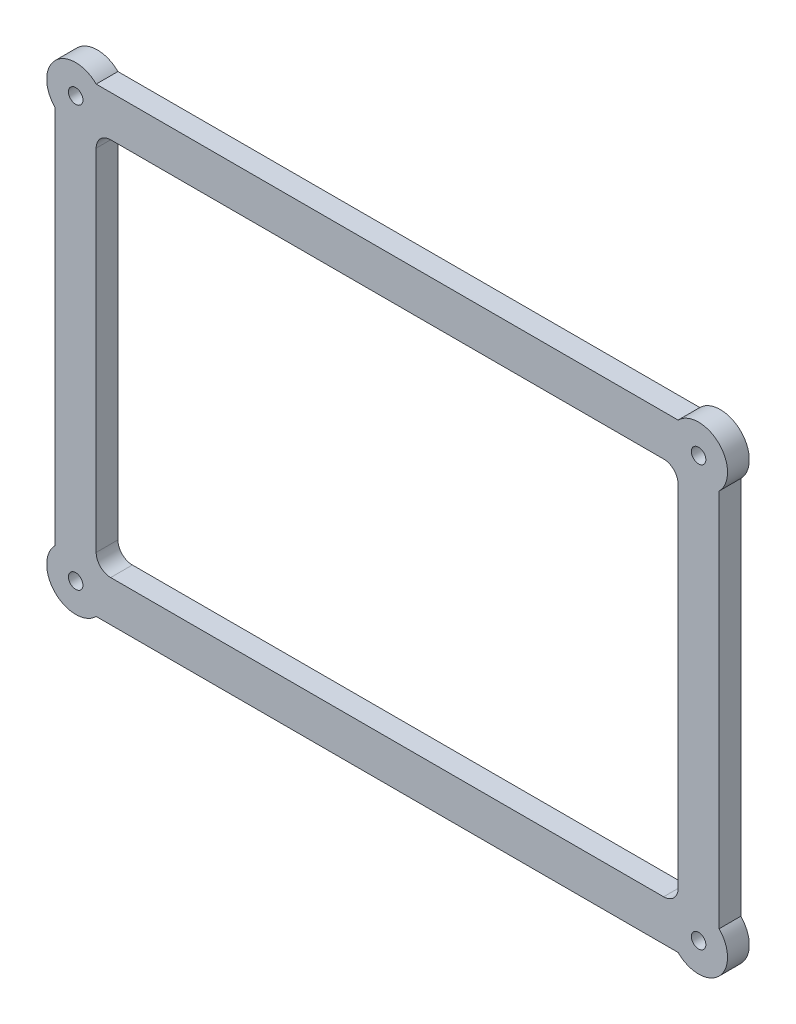
ISO-10303-21;
HEADER;
FILE_DESCRIPTION(('STEP AP214'),'2;1');
FILE_NAME('part.step','',(''),(''),'','','');
FILE_SCHEMA(('AUTOMOTIVE_DESIGN { 1 0 10303 214 1 1 1 1 }'));
ENDSEC;
DATA;
#1=APPLICATION_CONTEXT('core data for automotive mechanical design processes');
#2=APPLICATION_PROTOCOL_DEFINITION('international standard','automotive_design',2000,#1);
#3=PRODUCT_CONTEXT('',#1,'mechanical');
#4=PRODUCT('Part','Part','',(#3));
#5=PRODUCT_RELATED_PRODUCT_CATEGORY('part','',(#4));
#6=PRODUCT_DEFINITION_FORMATION('','',#4);
#7=PRODUCT_DEFINITION_CONTEXT('part definition',#1,'design');
#8=PRODUCT_DEFINITION('design','',#6,#7);
#9=PRODUCT_DEFINITION_SHAPE('','',#8);
#10=(LENGTH_UNIT() NAMED_UNIT(*) SI_UNIT(.MILLI.,.METRE.));
#11=(NAMED_UNIT(*) PLANE_ANGLE_UNIT() SI_UNIT($,.RADIAN.));
#12=(NAMED_UNIT(*) SI_UNIT($,.STERADIAN.) SOLID_ANGLE_UNIT());
#13=UNCERTAINTY_MEASURE_WITH_UNIT(LENGTH_MEASURE(1.E-05),#10,'distance_accuracy_value','');
#14=(GEOMETRIC_REPRESENTATION_CONTEXT(3) GLOBAL_UNCERTAINTY_ASSIGNED_CONTEXT((#13)) GLOBAL_UNIT_ASSIGNED_CONTEXT((#10,
#11,#12)) REPRESENTATION_CONTEXT('',''));
#15=CARTESIAN_POINT('',(0.,0.,0.));
#16=DIRECTION('',(0.,0.,1.));
#17=DIRECTION('',(1.,0.,0.));
#18=AXIS2_PLACEMENT_3D('',#15,#16,#17);
#19=CARTESIAN_POINT('',(0.,58.,3.));
#20=DIRECTION('',(0.,0.,1.));
#21=DIRECTION('',(1.,0.,0.));
#22=AXIS2_PLACEMENT_3D('',#19,#20,#21);
#23=PLANE('',#22);
#24=CARTESIAN_POINT('',(86.,58.,3.));
#25=DIRECTION('',(0.,0.,1.));
#26=DIRECTION('',(1.,0.,0.));
#27=AXIS2_PLACEMENT_3D('',#24,#25,#26);
#28=CIRCLE('',#27,0.999999999999998);
#29=CARTESIAN_POINT('',(87.,58.,3.));
#30=VERTEX_POINT('',#29);
#31=EDGE_CURVE('E288',#30,#30,#28,.T.);
#32=ORIENTED_EDGE('',*,*,#31,.F.);
#33=EDGE_LOOP('',(#32));
#34=FACE_BOUND('',#33,.T.);
#35=CARTESIAN_POINT('',(0.,58.,3.));
#36=DIRECTION('',(0.,0.,1.));
#37=DIRECTION('',(1.,0.,0.));
#38=AXIS2_PLACEMENT_3D('',#35,#36,#37);
#39=CIRCLE('',#38,1.);
#40=CARTESIAN_POINT('',(1.,58.,3.));
#41=VERTEX_POINT('',#40);
#42=EDGE_CURVE('E304',#41,#41,#39,.T.);
#43=ORIENTED_EDGE('',*,*,#42,.F.);
#44=EDGE_LOOP('',(#43));
#45=FACE_BOUND('',#44,.T.);
#46=CARTESIAN_POINT('',(0.,58.,3.));
#47=DIRECTION('',(0.,0.,1.));
#48=DIRECTION('',(1.,0.,0.));
#49=AXIS2_PLACEMENT_3D('',#46,#47,#48);
#50=CIRCLE('',#49,4.);
#51=CARTESIAN_POINT('',(2.82842712474619,60.8284271247462,3.));
#52=VERTEX_POINT('',#51);
#53=CARTESIAN_POINT('',(-2.82842712474619,55.1715728752538,3.));
#54=VERTEX_POINT('',#53);
#55=EDGE_CURVE('E169',#52,#54,#50,.T.);
#56=ORIENTED_EDGE('',*,*,#55,.T.);
#57=DIRECTION('',(0.,-1.,0.));
#58=VECTOR('',#57,1.);
#59=CARTESIAN_POINT('',(-2.82842712474619,55.1715728752538,3.));
#60=LINE('',#59,#58);
#61=CARTESIAN_POINT('',(-2.82842712474619,2.82842712474619,3.));
#62=VERTEX_POINT('',#61);
#63=EDGE_CURVE('E157',#54,#62,#60,.T.);
#64=ORIENTED_EDGE('',*,*,#63,.T.);
#65=CARTESIAN_POINT('',(0.,0.,3.));
#66=DIRECTION('',(0.,0.,1.));
#67=DIRECTION('',(1.,0.,0.));
#68=AXIS2_PLACEMENT_3D('',#65,#66,#67);
#69=CIRCLE('',#68,4.);
#70=CARTESIAN_POINT('',(2.82842712474619,-2.82842712474619,3.));
#71=VERTEX_POINT('',#70);
#72=EDGE_CURVE('E168',#62,#71,#69,.T.);
#73=ORIENTED_EDGE('',*,*,#72,.T.);
#74=DIRECTION('',(1.,0.,0.));
#75=VECTOR('',#74,1.);
#76=CARTESIAN_POINT('',(2.82842712474619,-2.82842712474619,3.));
#77=LINE('',#76,#75);
#78=CARTESIAN_POINT('',(83.1715728752538,-2.82842712474617,3.));
#79=VERTEX_POINT('',#78);
#80=EDGE_CURVE('E313',#71,#79,#77,.T.);
#81=ORIENTED_EDGE('',*,*,#80,.T.);
#82=CARTESIAN_POINT('',(86.,0.,3.));
#83=DIRECTION('',(0.,0.,1.));
#84=DIRECTION('',(1.,0.,0.));
#85=AXIS2_PLACEMENT_3D('',#82,#83,#84);
#86=CIRCLE('',#85,3.99999999999999);
#87=CARTESIAN_POINT('',(88.8284271247462,2.82842712474619,3.));
#88=VERTEX_POINT('',#87);
#89=EDGE_CURVE('E316',#79,#88,#86,.T.);
#90=ORIENTED_EDGE('',*,*,#89,.T.);
#91=DIRECTION('',(0.,1.,0.));
#92=VECTOR('',#91,1.);
#93=CARTESIAN_POINT('',(88.8284271247462,2.82842712474619,3.));
#94=LINE('',#93,#92);
#95=CARTESIAN_POINT('',(88.8284271247462,55.1715728752538,3.));
#96=VERTEX_POINT('',#95);
#97=EDGE_CURVE('E319',#88,#96,#94,.T.);
#98=ORIENTED_EDGE('',*,*,#97,.T.);
#99=CARTESIAN_POINT('',(86.,58.,3.));
#100=DIRECTION('',(0.,0.,1.));
#101=DIRECTION('',(1.,0.,0.));
#102=AXIS2_PLACEMENT_3D('',#99,#100,#101);
#103=CIRCLE('',#102,4.);
#104=CARTESIAN_POINT('',(83.1715728752538,60.8284271247462,3.));
#105=VERTEX_POINT('',#104);
#106=EDGE_CURVE('E322',#96,#105,#103,.T.);
#107=ORIENTED_EDGE('',*,*,#106,.T.);
#108=DIRECTION('',(-1.,0.,0.));
#109=VECTOR('',#108,1.);
#110=CARTESIAN_POINT('',(2.82842712474619,60.8284271247462,3.));
#111=LINE('',#110,#109);
#112=EDGE_CURVE('E174',#105,#52,#111,.T.);
#113=ORIENTED_EDGE('',*,*,#112,.T.);
#114=EDGE_LOOP('',(#56,#64,#73,#81,#90,#98,#107,#113));
#115=FACE_BOUND('',#114,.T.);
#116=CARTESIAN_POINT('',(0.,0.,3.));
#117=DIRECTION('',(0.,0.,1.));
#118=DIRECTION('',(1.,0.,0.));
#119=AXIS2_PLACEMENT_3D('',#116,#117,#118);
#120=CIRCLE('',#119,1.);
#121=CARTESIAN_POINT('',(1.,0.,3.));
#122=VERTEX_POINT('',#121);
#123=EDGE_CURVE('E296',#122,#122,#120,.T.);
#124=ORIENTED_EDGE('',*,*,#123,.F.);
#125=EDGE_LOOP('',(#124));
#126=FACE_BOUND('',#125,.T.);
#127=CARTESIAN_POINT('',(86.,0.,3.));
#128=DIRECTION('',(0.,0.,1.));
#129=DIRECTION('',(1.,0.,0.));
#130=AXIS2_PLACEMENT_3D('',#127,#128,#129);
#131=CIRCLE('',#130,0.999999999999998);
#132=CARTESIAN_POINT('',(87.,0.,3.));
#133=VERTEX_POINT('',#132);
#134=EDGE_CURVE('E280',#133,#133,#131,.T.);
#135=ORIENTED_EDGE('',*,*,#134,.F.);
#136=EDGE_LOOP('',(#135));
#137=FACE_BOUND('',#136,.T.);
#138=DIRECTION('',(-1.,0.,0.));
#139=VECTOR('',#138,1.);
#140=CARTESIAN_POINT('',(2.82842712474619,55.1715728752538,3.));
#141=LINE('',#140,#139);
#142=CARTESIAN_POINT('',(81.1715728752538,55.1715728752538,3.));
#143=VERTEX_POINT('',#142);
#144=CARTESIAN_POINT('',(4.82842712474619,55.1715728752538,3.));
#145=VERTEX_POINT('',#144);
#146=EDGE_CURVE('E255',#143,#145,#141,.T.);
#147=ORIENTED_EDGE('',*,*,#146,.F.);
#148=CARTESIAN_POINT('',(81.1715728752538,53.1715728752538,3.));
#149=DIRECTION('',(0.,0.,1.));
#150=DIRECTION('',(1.,0.,0.));
#151=AXIS2_PLACEMENT_3D('',#148,#149,#150);
#152=CIRCLE('',#151,2.);
#153=CARTESIAN_POINT('',(83.1715728752538,53.1715728752538,3.));
#154=VERTEX_POINT('',#153);
#155=EDGE_CURVE('E233',#143,#154,#152,.F.);
#156=ORIENTED_EDGE('',*,*,#155,.T.);
#157=DIRECTION('',(0.,1.,0.));
#158=VECTOR('',#157,1.);
#159=CARTESIAN_POINT('',(83.1715728752538,2.82842712474618,3.));
#160=LINE('',#159,#158);
#161=CARTESIAN_POINT('',(83.1715728752538,4.82842712474618,3.));
#162=VERTEX_POINT('',#161);
#163=EDGE_CURVE('E259',#162,#154,#160,.T.);
#164=ORIENTED_EDGE('',*,*,#163,.F.);
#165=CARTESIAN_POINT('',(81.1715728752538,4.82842712474618,3.));
#166=DIRECTION('',(0.,0.,1.));
#167=DIRECTION('',(1.,0.,0.));
#168=AXIS2_PLACEMENT_3D('',#165,#166,#167);
#169=CIRCLE('',#168,2.);
#170=CARTESIAN_POINT('',(81.1715728752538,2.82842712474618,3.));
#171=VERTEX_POINT('',#170);
#172=EDGE_CURVE('E227',#162,#171,#169,.F.);
#173=ORIENTED_EDGE('',*,*,#172,.T.);
#174=DIRECTION('',(1.,0.,0.));
#175=VECTOR('',#174,1.);
#176=CARTESIAN_POINT('',(2.82842712474619,2.82842712474619,3.));
#177=LINE('',#176,#175);
#178=CARTESIAN_POINT('',(4.82842712474619,2.82842712474619,3.));
#179=VERTEX_POINT('',#178);
#180=EDGE_CURVE('E263',#179,#171,#177,.T.);
#181=ORIENTED_EDGE('',*,*,#180,.F.);
#182=CARTESIAN_POINT('',(4.82842712474619,4.82842712474619,3.));
#183=DIRECTION('',(0.,0.,1.));
#184=DIRECTION('',(1.,0.,0.));
#185=AXIS2_PLACEMENT_3D('',#182,#183,#184);
#186=CIRCLE('',#185,2.);
#187=CARTESIAN_POINT('',(2.82842712474619,4.82842712474619,3.));
#188=VERTEX_POINT('',#187);
#189=EDGE_CURVE('E221',#179,#188,#186,.F.);
#190=ORIENTED_EDGE('',*,*,#189,.T.);
#191=DIRECTION('',(0.,-1.,0.));
#192=VECTOR('',#191,1.);
#193=CARTESIAN_POINT('',(2.82842712474619,55.1715728752538,3.));
#194=LINE('',#193,#192);
#195=CARTESIAN_POINT('',(2.82842712474619,53.1715728752538,3.));
#196=VERTEX_POINT('',#195);
#197=EDGE_CURVE('E258',#196,#188,#194,.T.);
#198=ORIENTED_EDGE('',*,*,#197,.F.);
#199=CARTESIAN_POINT('',(4.82842712474619,53.1715728752538,3.));
#200=DIRECTION('',(0.,0.,1.));
#201=DIRECTION('',(1.,0.,0.));
#202=AXIS2_PLACEMENT_3D('',#199,#200,#201);
#203=CIRCLE('',#202,2.);
#204=EDGE_CURVE('E11',#196,#145,#203,.F.);
#205=ORIENTED_EDGE('',*,*,#204,.T.);
#206=EDGE_LOOP('',(#147,#156,#164,#173,#181,#190,#198,#205));
#207=FACE_BOUND('',#206,.T.);
#208=ADVANCED_FACE('F43',(#34,#45,#115,#126,#137,#207),#23,.T.);
#209=CARTESIAN_POINT('',(0.,58.,0.));
#210=DIRECTION('',(0.,0.,1.));
#211=DIRECTION('',(1.,0.,0.));
#212=AXIS2_PLACEMENT_3D('',#209,#210,#211);
#213=PLANE('',#212);
#214=CARTESIAN_POINT('',(86.,0.,0.));
#215=DIRECTION('',(0.,0.,1.));
#216=DIRECTION('',(1.,0.,0.));
#217=AXIS2_PLACEMENT_3D('',#214,#215,#216);
#218=CIRCLE('',#217,0.999999999999998);
#219=CARTESIAN_POINT('',(87.,0.,0.));
#220=VERTEX_POINT('',#219);
#221=EDGE_CURVE('E271',#220,#220,#218,.T.);
#222=ORIENTED_EDGE('',*,*,#221,.T.);
#223=EDGE_LOOP('',(#222));
#224=FACE_BOUND('',#223,.T.);
#225=CARTESIAN_POINT('',(86.,58.,0.));
#226=DIRECTION('',(0.,0.,1.));
#227=DIRECTION('',(1.,0.,0.));
#228=AXIS2_PLACEMENT_3D('',#225,#226,#227);
#229=CIRCLE('',#228,0.999999999999998);
#230=CARTESIAN_POINT('',(87.,58.,0.));
#231=VERTEX_POINT('',#230);
#232=EDGE_CURVE('E284',#231,#231,#229,.T.);
#233=ORIENTED_EDGE('',*,*,#232,.T.);
#234=EDGE_LOOP('',(#233));
#235=FACE_BOUND('',#234,.T.);
#236=CARTESIAN_POINT('',(0.,0.,0.));
#237=DIRECTION('',(0.,0.,1.));
#238=DIRECTION('',(1.,0.,0.));
#239=AXIS2_PLACEMENT_3D('',#236,#237,#238);
#240=CIRCLE('',#239,1.);
#241=CARTESIAN_POINT('',(1.,0.,0.));
#242=VERTEX_POINT('',#241);
#243=EDGE_CURVE('E292',#242,#242,#240,.T.);
#244=ORIENTED_EDGE('',*,*,#243,.T.);
#245=EDGE_LOOP('',(#244));
#246=FACE_BOUND('',#245,.T.);
#247=CARTESIAN_POINT('',(0.,58.,0.));
#248=DIRECTION('',(0.,0.,1.));
#249=DIRECTION('',(1.,0.,0.));
#250=AXIS2_PLACEMENT_3D('',#247,#248,#249);
#251=CIRCLE('',#250,1.);
#252=CARTESIAN_POINT('',(1.,58.,0.));
#253=VERTEX_POINT('',#252);
#254=EDGE_CURVE('E300',#253,#253,#251,.T.);
#255=ORIENTED_EDGE('',*,*,#254,.T.);
#256=EDGE_LOOP('',(#255));
#257=FACE_BOUND('',#256,.T.);
#258=CARTESIAN_POINT('',(0.,58.,0.));
#259=DIRECTION('',(0.,0.,1.));
#260=DIRECTION('',(1.,0.,0.));
#261=AXIS2_PLACEMENT_3D('',#258,#259,#260);
#262=CIRCLE('',#261,4.);
#263=CARTESIAN_POINT('',(2.82842712474619,60.8284271247462,0.));
#264=VERTEX_POINT('',#263);
#265=CARTESIAN_POINT('',(-2.82842712474619,55.1715728752538,0.));
#266=VERTEX_POINT('',#265);
#267=EDGE_CURVE('E183',#264,#266,#262,.T.);
#268=ORIENTED_EDGE('',*,*,#267,.F.);
#269=DIRECTION('',(-1.,0.,0.));
#270=VECTOR('',#269,1.);
#271=CARTESIAN_POINT('',(2.82842712474619,60.8284271247462,0.));
#272=LINE('',#271,#270);
#273=CARTESIAN_POINT('',(83.1715728752538,60.8284271247462,0.));
#274=VERTEX_POINT('',#273);
#275=EDGE_CURVE('E179',#274,#264,#272,.T.);
#276=ORIENTED_EDGE('',*,*,#275,.F.);
#277=CARTESIAN_POINT('',(86.,58.,0.));
#278=DIRECTION('',(0.,0.,1.));
#279=DIRECTION('',(1.,0.,0.));
#280=AXIS2_PLACEMENT_3D('',#277,#278,#279);
#281=CIRCLE('',#280,4.);
#282=CARTESIAN_POINT('',(88.8284271247462,55.1715728752538,0.));
#283=VERTEX_POINT('',#282);
#284=EDGE_CURVE('E345',#283,#274,#281,.T.);
#285=ORIENTED_EDGE('',*,*,#284,.F.);
#286=DIRECTION('',(0.,1.,0.));
#287=VECTOR('',#286,1.);
#288=CARTESIAN_POINT('',(88.8284271247462,2.82842712474619,0.));
#289=LINE('',#288,#287);
#290=CARTESIAN_POINT('',(88.8284271247462,2.82842712474619,0.));
#291=VERTEX_POINT('',#290);
#292=EDGE_CURVE('E342',#291,#283,#289,.T.);
#293=ORIENTED_EDGE('',*,*,#292,.F.);
#294=CARTESIAN_POINT('',(86.,0.,0.));
#295=DIRECTION('',(0.,0.,1.));
#296=DIRECTION('',(1.,0.,0.));
#297=AXIS2_PLACEMENT_3D('',#294,#295,#296);
#298=CIRCLE('',#297,3.99999999999999);
#299=CARTESIAN_POINT('',(83.1715728752538,-2.82842712474617,0.));
#300=VERTEX_POINT('',#299);
#301=EDGE_CURVE('E339',#300,#291,#298,.T.);
#302=ORIENTED_EDGE('',*,*,#301,.F.);
#303=DIRECTION('',(1.,0.,0.));
#304=VECTOR('',#303,1.);
#305=CARTESIAN_POINT('',(2.82842712474619,-2.82842712474619,0.));
#306=LINE('',#305,#304);
#307=CARTESIAN_POINT('',(2.82842712474619,-2.82842712474619,0.));
#308=VERTEX_POINT('',#307);
#309=EDGE_CURVE('E336',#308,#300,#306,.T.);
#310=ORIENTED_EDGE('',*,*,#309,.F.);
#311=CARTESIAN_POINT('',(0.,0.,0.));
#312=DIRECTION('',(0.,0.,1.));
#313=DIRECTION('',(1.,0.,0.));
#314=AXIS2_PLACEMENT_3D('',#311,#312,#313);
#315=CIRCLE('',#314,4.);
#316=CARTESIAN_POINT('',(-2.82842712474619,2.82842712474619,0.));
#317=VERTEX_POINT('',#316);
#318=EDGE_CURVE('E333',#317,#308,#315,.T.);
#319=ORIENTED_EDGE('',*,*,#318,.F.);
#320=DIRECTION('',(0.,-1.,0.));
#321=VECTOR('',#320,1.);
#322=CARTESIAN_POINT('',(-2.82842712474619,55.1715728752538,0.));
#323=LINE('',#322,#321);
#324=EDGE_CURVE('E330',#266,#317,#323,.T.);
#325=ORIENTED_EDGE('',*,*,#324,.F.);
#326=EDGE_LOOP('',(#268,#276,#285,#293,#302,#310,#319,#325));
#327=FACE_BOUND('',#326,.T.);
#328=DIRECTION('',(1.,0.,0.));
#329=VECTOR('',#328,1.);
#330=CARTESIAN_POINT('',(2.82842712474619,2.82842712474619,0.));
#331=LINE('',#330,#329);
#332=CARTESIAN_POINT('',(4.82842712474619,2.82842712474619,0.));
#333=VERTEX_POINT('',#332);
#334=CARTESIAN_POINT('',(81.1715728752538,2.82842712474618,0.));
#335=VERTEX_POINT('',#334);
#336=EDGE_CURVE('E252',#333,#335,#331,.T.);
#337=ORIENTED_EDGE('',*,*,#336,.T.);
#338=CARTESIAN_POINT('',(81.1715728752538,4.82842712474618,0.));
#339=DIRECTION('',(0.,0.,1.));
#340=DIRECTION('',(1.,0.,0.));
#341=AXIS2_PLACEMENT_3D('',#338,#339,#340);
#342=CIRCLE('',#341,2.);
#343=CARTESIAN_POINT('',(83.1715728752538,4.82842712474618,0.));
#344=VERTEX_POINT('',#343);
#345=EDGE_CURVE('E224',#335,#344,#342,.T.);
#346=ORIENTED_EDGE('',*,*,#345,.T.);
#347=DIRECTION('',(0.,1.,0.));
#348=VECTOR('',#347,1.);
#349=CARTESIAN_POINT('',(83.1715728752538,2.82842712474618,0.));
#350=LINE('',#349,#348);
#351=CARTESIAN_POINT('',(83.1715728752538,53.1715728752538,0.));
#352=VERTEX_POINT('',#351);
#353=EDGE_CURVE('E272',#344,#352,#350,.T.);
#354=ORIENTED_EDGE('',*,*,#353,.T.);
#355=CARTESIAN_POINT('',(81.1715728752538,53.1715728752538,0.));
#356=DIRECTION('',(0.,0.,1.));
#357=DIRECTION('',(1.,0.,0.));
#358=AXIS2_PLACEMENT_3D('',#355,#356,#357);
#359=CIRCLE('',#358,2.);
#360=CARTESIAN_POINT('',(81.1715728752538,55.1715728752538,0.));
#361=VERTEX_POINT('',#360);
#362=EDGE_CURVE('E230',#352,#361,#359,.T.);
#363=ORIENTED_EDGE('',*,*,#362,.T.);
#364=DIRECTION('',(-1.,0.,0.));
#365=VECTOR('',#364,1.);
#366=CARTESIAN_POINT('',(2.82842712474619,55.1715728752538,0.));
#367=LINE('',#366,#365);
#368=CARTESIAN_POINT('',(4.82842712474619,55.1715728752538,0.));
#369=VERTEX_POINT('',#368);
#370=EDGE_CURVE('E243',#361,#369,#367,.T.);
#371=ORIENTED_EDGE('',*,*,#370,.T.);
#372=CARTESIAN_POINT('',(4.82842712474619,53.1715728752538,0.));
#373=DIRECTION('',(0.,0.,1.));
#374=DIRECTION('',(1.,0.,0.));
#375=AXIS2_PLACEMENT_3D('',#372,#373,#374);
#376=CIRCLE('',#375,2.);
#377=CARTESIAN_POINT('',(2.82842712474619,53.1715728752538,0.));
#378=VERTEX_POINT('',#377);
#379=EDGE_CURVE('E52',#369,#378,#376,.T.);
#380=ORIENTED_EDGE('',*,*,#379,.T.);
#381=DIRECTION('',(0.,-1.,0.));
#382=VECTOR('',#381,1.);
#383=CARTESIAN_POINT('',(2.82842712474619,55.1715728752538,0.));
#384=LINE('',#383,#382);
#385=CARTESIAN_POINT('',(2.82842712474619,4.82842712474619,0.));
#386=VERTEX_POINT('',#385);
#387=EDGE_CURVE('E242',#378,#386,#384,.T.);
#388=ORIENTED_EDGE('',*,*,#387,.T.);
#389=CARTESIAN_POINT('',(4.82842712474619,4.82842712474619,0.));
#390=DIRECTION('',(0.,0.,1.));
#391=DIRECTION('',(1.,0.,0.));
#392=AXIS2_PLACEMENT_3D('',#389,#390,#391);
#393=CIRCLE('',#392,2.);
#394=EDGE_CURVE('E218',#386,#333,#393,.T.);
#395=ORIENTED_EDGE('',*,*,#394,.T.);
#396=EDGE_LOOP('',(#337,#346,#354,#363,#371,#380,#388,#395));
#397=FACE_BOUND('',#396,.T.);
#398=ADVANCED_FACE('F241',(#224,#235,#246,#257,#327,#397),#213,.F.);
#399=CARTESIAN_POINT('',(0.,58.,3.));
#400=DIRECTION('',(0.,0.,-1.));
#401=DIRECTION('',(-1.,0.,0.));
#402=AXIS2_PLACEMENT_3D('',#399,#400,#401);
#403=CYLINDRICAL_SURFACE('',#402,4.);
#404=ORIENTED_EDGE('',*,*,#267,.T.);
#405=DIRECTION('',(0.,0.,-1.));
#406=VECTOR('',#405,1.);
#407=CARTESIAN_POINT('',(-2.82842712474619,55.1715728752538,3.));
#408=LINE('',#407,#406);
#409=EDGE_CURVE('E161',#54,#266,#408,.T.);
#410=ORIENTED_EDGE('',*,*,#409,.F.);
#411=ORIENTED_EDGE('',*,*,#55,.F.);
#412=DIRECTION('',(0.,0.,-1.));
#413=VECTOR('',#412,1.);
#414=CARTESIAN_POINT('',(2.82842712474619,60.8284271247462,3.));
#415=LINE('',#414,#413);
#416=EDGE_CURVE('E327',#52,#264,#415,.T.);
#417=ORIENTED_EDGE('',*,*,#416,.T.);
#418=EDGE_LOOP('',(#404,#410,#411,#417));
#419=FACE_BOUND('',#418,.T.);
#420=ADVANCED_FACE('F181',(#419),#403,.T.);
#421=CARTESIAN_POINT('',(-2.82842712474619,55.1715728752538,3.));
#422=DIRECTION('',(1.,0.,0.));
#423=DIRECTION('',(0.,0.,-1.));
#424=AXIS2_PLACEMENT_3D('',#421,#422,#423);
#425=PLANE('',#424);
#426=ORIENTED_EDGE('',*,*,#324,.T.);
#427=DIRECTION('',(0.,0.,-1.));
#428=VECTOR('',#427,1.);
#429=CARTESIAN_POINT('',(-2.82842712474619,2.82842712474619,3.));
#430=LINE('',#429,#428);
#431=EDGE_CURVE('E164',#62,#317,#430,.T.);
#432=ORIENTED_EDGE('',*,*,#431,.F.);
#433=ORIENTED_EDGE('',*,*,#63,.F.);
#434=ORIENTED_EDGE('',*,*,#409,.T.);
#435=EDGE_LOOP('',(#426,#432,#433,#434));
#436=FACE_BOUND('',#435,.T.);
#437=ADVANCED_FACE('F159',(#436),#425,.F.);
#438=CARTESIAN_POINT('',(0.,0.,3.));
#439=DIRECTION('',(0.,0.,-1.));
#440=DIRECTION('',(-1.,0.,0.));
#441=AXIS2_PLACEMENT_3D('',#438,#439,#440);
#442=CYLINDRICAL_SURFACE('',#441,4.);
#443=ORIENTED_EDGE('',*,*,#318,.T.);
#444=DIRECTION('',(0.,0.,-1.));
#445=VECTOR('',#444,1.);
#446=CARTESIAN_POINT('',(2.82842712474619,-2.82842712474619,3.));
#447=LINE('',#446,#445);
#448=EDGE_CURVE('E191',#71,#308,#447,.T.);
#449=ORIENTED_EDGE('',*,*,#448,.F.);
#450=ORIENTED_EDGE('',*,*,#72,.F.);
#451=ORIENTED_EDGE('',*,*,#431,.T.);
#452=EDGE_LOOP('',(#443,#449,#450,#451));
#453=FACE_BOUND('',#452,.T.);
#454=ADVANCED_FACE('F391',(#453),#442,.T.);
#455=CARTESIAN_POINT('',(2.82842712474619,-2.82842712474619,3.));
#456=DIRECTION('',(0.,1.,0.));
#457=DIRECTION('',(-1.,0.,0.));
#458=AXIS2_PLACEMENT_3D('',#455,#456,#457);
#459=PLANE('',#458);
#460=ORIENTED_EDGE('',*,*,#309,.T.);
#461=DIRECTION('',(0.,0.,-1.));
#462=VECTOR('',#461,1.);
#463=CARTESIAN_POINT('',(83.1715728752538,-2.82842712474617,3.));
#464=LINE('',#463,#462);
#465=EDGE_CURVE('E364',#79,#300,#464,.T.);
#466=ORIENTED_EDGE('',*,*,#465,.F.);
#467=ORIENTED_EDGE('',*,*,#80,.F.);
#468=ORIENTED_EDGE('',*,*,#448,.T.);
#469=EDGE_LOOP('',(#460,#466,#467,#468));
#470=FACE_BOUND('',#469,.T.);
#471=ADVANCED_FACE('F373',(#470),#459,.F.);
#472=CARTESIAN_POINT('',(86.,0.,3.));
#473=DIRECTION('',(0.,0.,-1.));
#474=DIRECTION('',(-1.,0.,0.));
#475=AXIS2_PLACEMENT_3D('',#472,#473,#474);
#476=CYLINDRICAL_SURFACE('',#475,3.99999999999999);
#477=ORIENTED_EDGE('',*,*,#301,.T.);
#478=DIRECTION('',(0.,0.,-1.));
#479=VECTOR('',#478,1.);
#480=CARTESIAN_POINT('',(88.8284271247462,2.82842712474619,3.));
#481=LINE('',#480,#479);
#482=EDGE_CURVE('E360',#88,#291,#481,.T.);
#483=ORIENTED_EDGE('',*,*,#482,.F.);
#484=ORIENTED_EDGE('',*,*,#89,.F.);
#485=ORIENTED_EDGE('',*,*,#465,.T.);
#486=EDGE_LOOP('',(#477,#483,#484,#485));
#487=FACE_BOUND('',#486,.T.);
#488=ADVANCED_FACE('F383',(#487),#476,.T.);
#489=CARTESIAN_POINT('',(88.8284271247462,2.82842712474619,3.));
#490=DIRECTION('',(-1.,0.,0.));
#491=DIRECTION('',(0.,0.,1.));
#492=AXIS2_PLACEMENT_3D('',#489,#490,#491);
#493=PLANE('',#492);
#494=ORIENTED_EDGE('',*,*,#292,.T.);
#495=DIRECTION('',(0.,0.,-1.));
#496=VECTOR('',#495,1.);
#497=CARTESIAN_POINT('',(88.8284271247462,55.1715728752538,3.));
#498=LINE('',#497,#496);
#499=EDGE_CURVE('E356',#96,#283,#498,.T.);
#500=ORIENTED_EDGE('',*,*,#499,.F.);
#501=ORIENTED_EDGE('',*,*,#97,.F.);
#502=ORIENTED_EDGE('',*,*,#482,.T.);
#503=EDGE_LOOP('',(#494,#500,#501,#502));
#504=FACE_BOUND('',#503,.T.);
#505=ADVANCED_FACE('F387',(#504),#493,.F.);
#506=CARTESIAN_POINT('',(86.,58.,3.));
#507=DIRECTION('',(0.,0.,-1.));
#508=DIRECTION('',(-1.,0.,0.));
#509=AXIS2_PLACEMENT_3D('',#506,#507,#508);
#510=CYLINDRICAL_SURFACE('',#509,4.);
#511=ORIENTED_EDGE('',*,*,#284,.T.);
#512=DIRECTION('',(0.,0.,-1.));
#513=VECTOR('',#512,1.);
#514=CARTESIAN_POINT('',(83.1715728752538,60.8284271247462,3.));
#515=LINE('',#514,#513);
#516=EDGE_CURVE('E352',#105,#274,#515,.T.);
#517=ORIENTED_EDGE('',*,*,#516,.F.);
#518=ORIENTED_EDGE('',*,*,#106,.F.);
#519=ORIENTED_EDGE('',*,*,#499,.T.);
#520=EDGE_LOOP('',(#511,#517,#518,#519));
#521=FACE_BOUND('',#520,.T.);
#522=ADVANCED_FACE('F417',(#521),#510,.T.);
#523=CARTESIAN_POINT('',(2.82842712474619,60.8284271247462,3.));
#524=DIRECTION('',(0.,-1.,0.));
#525=DIRECTION('',(1.,0.,0.));
#526=AXIS2_PLACEMENT_3D('',#523,#524,#525);
#527=PLANE('',#526);
#528=ORIENTED_EDGE('',*,*,#275,.T.);
#529=ORIENTED_EDGE('',*,*,#416,.F.);
#530=ORIENTED_EDGE('',*,*,#112,.F.);
#531=ORIENTED_EDGE('',*,*,#516,.T.);
#532=EDGE_LOOP('',(#528,#529,#530,#531));
#533=FACE_BOUND('',#532,.T.);
#534=ADVANCED_FACE('F414',(#533),#527,.F.);
#535=CARTESIAN_POINT('',(0.,58.,3.));
#536=DIRECTION('',(0.,0.,-1.));
#537=DIRECTION('',(-1.,0.,0.));
#538=AXIS2_PLACEMENT_3D('',#535,#536,#537);
#539=CYLINDRICAL_SURFACE('',#538,1.);
#540=ORIENTED_EDGE('',*,*,#42,.T.);
#541=EDGE_LOOP('',(#540));
#542=FACE_BOUND('',#541,.T.);
#543=ORIENTED_EDGE('',*,*,#254,.F.);
#544=EDGE_LOOP('',(#543));
#545=FACE_BOUND('',#544,.T.);
#546=ADVANCED_FACE('F411',(#542,#545),#539,.F.);
#547=CARTESIAN_POINT('',(0.,0.,3.));
#548=DIRECTION('',(0.,0.,-1.));
#549=DIRECTION('',(-1.,0.,0.));
#550=AXIS2_PLACEMENT_3D('',#547,#548,#549);
#551=CYLINDRICAL_SURFACE('',#550,1.);
#552=ORIENTED_EDGE('',*,*,#123,.T.);
#553=EDGE_LOOP('',(#552));
#554=FACE_BOUND('',#553,.T.);
#555=ORIENTED_EDGE('',*,*,#243,.F.);
#556=EDGE_LOOP('',(#555));
#557=FACE_BOUND('',#556,.T.);
#558=ADVANCED_FACE('F447',(#554,#557),#551,.F.);
#559=CARTESIAN_POINT('',(86.,58.,3.));
#560=DIRECTION('',(0.,0.,-1.));
#561=DIRECTION('',(-1.,0.,0.));
#562=AXIS2_PLACEMENT_3D('',#559,#560,#561);
#563=CYLINDRICAL_SURFACE('',#562,0.999999999999998);
#564=ORIENTED_EDGE('',*,*,#31,.T.);
#565=EDGE_LOOP('',(#564));
#566=FACE_BOUND('',#565,.T.);
#567=ORIENTED_EDGE('',*,*,#232,.F.);
#568=EDGE_LOOP('',(#567));
#569=FACE_BOUND('',#568,.T.);
#570=ADVANCED_FACE('F454',(#566,#569),#563,.F.);
#571=CARTESIAN_POINT('',(86.,0.,3.));
#572=DIRECTION('',(0.,0.,-1.));
#573=DIRECTION('',(-1.,0.,0.));
#574=AXIS2_PLACEMENT_3D('',#571,#572,#573);
#575=CYLINDRICAL_SURFACE('',#574,0.999999999999998);
#576=ORIENTED_EDGE('',*,*,#134,.T.);
#577=EDGE_LOOP('',(#576));
#578=FACE_BOUND('',#577,.T.);
#579=ORIENTED_EDGE('',*,*,#221,.F.);
#580=EDGE_LOOP('',(#579));
#581=FACE_BOUND('',#580,.T.);
#582=ADVANCED_FACE('F461',(#578,#581),#575,.F.);
#583=CARTESIAN_POINT('',(83.1715728752538,2.82842712474618,3.));
#584=DIRECTION('',(-1.,0.,0.));
#585=DIRECTION('',(0.,0.,1.));
#586=AXIS2_PLACEMENT_3D('',#583,#584,#585);
#587=PLANE('',#586);
#588=ORIENTED_EDGE('',*,*,#353,.F.);
#589=DIRECTION('',(0.,0.,-1.));
#590=VECTOR('',#589,1.);
#591=CARTESIAN_POINT('',(83.1715728752538,4.82842712474618,3.));
#592=LINE('',#591,#590);
#593=EDGE_CURVE('E209',#344,#162,#592,.F.);
#594=ORIENTED_EDGE('',*,*,#593,.T.);
#595=ORIENTED_EDGE('',*,*,#163,.T.);
#596=DIRECTION('',(0.,0.,-1.));
#597=VECTOR('',#596,1.);
#598=CARTESIAN_POINT('',(83.1715728752538,53.1715728752538,0.));
#599=LINE('',#598,#597);
#600=EDGE_CURVE('E205',#154,#352,#599,.T.);
#601=ORIENTED_EDGE('',*,*,#600,.T.);
#602=EDGE_LOOP('',(#588,#594,#595,#601));
#603=FACE_BOUND('',#602,.T.);
#604=ADVANCED_FACE('F469',(#603),#587,.T.);
#605=CARTESIAN_POINT('',(2.82842712474619,55.1715728752538,3.));
#606=DIRECTION('',(0.,-1.,0.));
#607=DIRECTION('',(1.,0.,0.));
#608=AXIS2_PLACEMENT_3D('',#605,#606,#607);
#609=PLANE('',#608);
#610=ORIENTED_EDGE('',*,*,#370,.F.);
#611=DIRECTION('',(0.,0.,-1.));
#612=VECTOR('',#611,1.);
#613=CARTESIAN_POINT('',(81.1715728752538,55.1715728752538,3.));
#614=LINE('',#613,#612);
#615=EDGE_CURVE('E64',#361,#143,#614,.F.);
#616=ORIENTED_EDGE('',*,*,#615,.T.);
#617=ORIENTED_EDGE('',*,*,#146,.T.);
#618=DIRECTION('',(0.,0.,-1.));
#619=VECTOR('',#618,1.);
#620=CARTESIAN_POINT('',(4.82842712474619,55.1715728752538,0.));
#621=LINE('',#620,#619);
#622=EDGE_CURVE('E212',#145,#369,#621,.T.);
#623=ORIENTED_EDGE('',*,*,#622,.T.);
#624=EDGE_LOOP('',(#610,#616,#617,#623));
#625=FACE_BOUND('',#624,.T.);
#626=ADVANCED_FACE('F254',(#625),#609,.T.);
#627=CARTESIAN_POINT('',(2.82842712474619,55.1715728752538,3.));
#628=DIRECTION('',(1.,0.,0.));
#629=DIRECTION('',(0.,0.,-1.));
#630=AXIS2_PLACEMENT_3D('',#627,#628,#629);
#631=PLANE('',#630);
#632=ORIENTED_EDGE('',*,*,#197,.T.);
#633=DIRECTION('',(0.,0.,-1.));
#634=VECTOR('',#633,1.);
#635=CARTESIAN_POINT('',(2.82842712474619,4.82842712474619,0.));
#636=LINE('',#635,#634);
#637=EDGE_CURVE('E189',#188,#386,#636,.T.);
#638=ORIENTED_EDGE('',*,*,#637,.T.);
#639=ORIENTED_EDGE('',*,*,#387,.F.);
#640=DIRECTION('',(0.,0.,-1.));
#641=VECTOR('',#640,1.);
#642=CARTESIAN_POINT('',(2.82842712474619,53.1715728752538,3.));
#643=LINE('',#642,#641);
#644=EDGE_CURVE('E185',#378,#196,#643,.F.);
#645=ORIENTED_EDGE('',*,*,#644,.T.);
#646=EDGE_LOOP('',(#632,#638,#639,#645));
#647=FACE_BOUND('',#646,.T.);
#648=ADVANCED_FACE('F249',(#647),#631,.T.);
#649=CARTESIAN_POINT('',(2.82842712474619,2.82842712474619,3.));
#650=DIRECTION('',(0.,1.,0.));
#651=DIRECTION('',(-1.,0.,0.));
#652=AXIS2_PLACEMENT_3D('',#649,#650,#651);
#653=PLANE('',#652);
#654=ORIENTED_EDGE('',*,*,#336,.F.);
#655=DIRECTION('',(0.,0.,-1.));
#656=VECTOR('',#655,1.);
#657=CARTESIAN_POINT('',(4.82842712474619,2.82842712474619,3.));
#658=LINE('',#657,#656);
#659=EDGE_CURVE('E202',#333,#179,#658,.F.);
#660=ORIENTED_EDGE('',*,*,#659,.T.);
#661=ORIENTED_EDGE('',*,*,#180,.T.);
#662=DIRECTION('',(0.,0.,-1.));
#663=VECTOR('',#662,1.);
#664=CARTESIAN_POINT('',(81.1715728752538,2.82842712474618,0.));
#665=LINE('',#664,#663);
#666=EDGE_CURVE('E198',#171,#335,#665,.T.);
#667=ORIENTED_EDGE('',*,*,#666,.T.);
#668=EDGE_LOOP('',(#654,#660,#661,#667));
#669=FACE_BOUND('',#668,.T.);
#670=ADVANCED_FACE('F491',(#669),#653,.T.);
#671=CARTESIAN_POINT('',(4.82842712474619,4.82842712474619,3.));
#672=DIRECTION('',(0.,0.,1.));
#673=DIRECTION('',(1.,0.,0.));
#674=AXIS2_PLACEMENT_3D('',#671,#672,#673);
#675=CYLINDRICAL_SURFACE('',#674,2.);
#676=ORIENTED_EDGE('',*,*,#189,.F.);
#677=ORIENTED_EDGE('',*,*,#659,.F.);
#678=ORIENTED_EDGE('',*,*,#394,.F.);
#679=ORIENTED_EDGE('',*,*,#637,.F.);
#680=EDGE_LOOP('',(#676,#677,#678,#679));
#681=FACE_BOUND('',#680,.T.);
#682=ADVANCED_FACE('F498',(#681),#675,.F.);
#683=CARTESIAN_POINT('',(81.1715728752538,4.82842712474618,3.));
#684=DIRECTION('',(0.,0.,1.));
#685=DIRECTION('',(1.,0.,0.));
#686=AXIS2_PLACEMENT_3D('',#683,#684,#685);
#687=CYLINDRICAL_SURFACE('',#686,2.);
#688=ORIENTED_EDGE('',*,*,#172,.F.);
#689=ORIENTED_EDGE('',*,*,#593,.F.);
#690=ORIENTED_EDGE('',*,*,#345,.F.);
#691=ORIENTED_EDGE('',*,*,#666,.F.);
#692=EDGE_LOOP('',(#688,#689,#690,#691));
#693=FACE_BOUND('',#692,.T.);
#694=ADVANCED_FACE('F506',(#693),#687,.F.);
#695=CARTESIAN_POINT('',(81.1715728752538,53.1715728752538,3.));
#696=DIRECTION('',(0.,0.,1.));
#697=DIRECTION('',(1.,0.,0.));
#698=AXIS2_PLACEMENT_3D('',#695,#696,#697);
#699=CYLINDRICAL_SURFACE('',#698,2.);
#700=ORIENTED_EDGE('',*,*,#155,.F.);
#701=ORIENTED_EDGE('',*,*,#615,.F.);
#702=ORIENTED_EDGE('',*,*,#362,.F.);
#703=ORIENTED_EDGE('',*,*,#600,.F.);
#704=EDGE_LOOP('',(#700,#701,#702,#703));
#705=FACE_BOUND('',#704,.T.);
#706=ADVANCED_FACE('F514',(#705),#699,.F.);
#707=CARTESIAN_POINT('',(4.82842712474619,53.1715728752538,3.));
#708=DIRECTION('',(0.,0.,1.));
#709=DIRECTION('',(1.,0.,0.));
#710=AXIS2_PLACEMENT_3D('',#707,#708,#709);
#711=CYLINDRICAL_SURFACE('',#710,2.);
#712=ORIENTED_EDGE('',*,*,#204,.F.);
#713=ORIENTED_EDGE('',*,*,#644,.F.);
#714=ORIENTED_EDGE('',*,*,#379,.F.);
#715=ORIENTED_EDGE('',*,*,#622,.F.);
#716=EDGE_LOOP('',(#712,#713,#714,#715));
#717=FACE_BOUND('',#716,.T.);
#718=ADVANCED_FACE('F45',(#717),#711,.F.);
#719=CLOSED_SHELL('',(#208,#398,#420,#437,#454,#471,#488,#505,#522,#534,#546,#558,#570,#582,
#604,#626,#648,#670,#682,#694,#706,#718));
#720=MANIFOLD_SOLID_BREP('B2',#719);
#721=ADVANCED_BREP_SHAPE_REPRESENTATION('',(#18,#720),#14);
#722=SHAPE_DEFINITION_REPRESENTATION(#9,#721);
ENDSEC;
END-ISO-10303-21;
